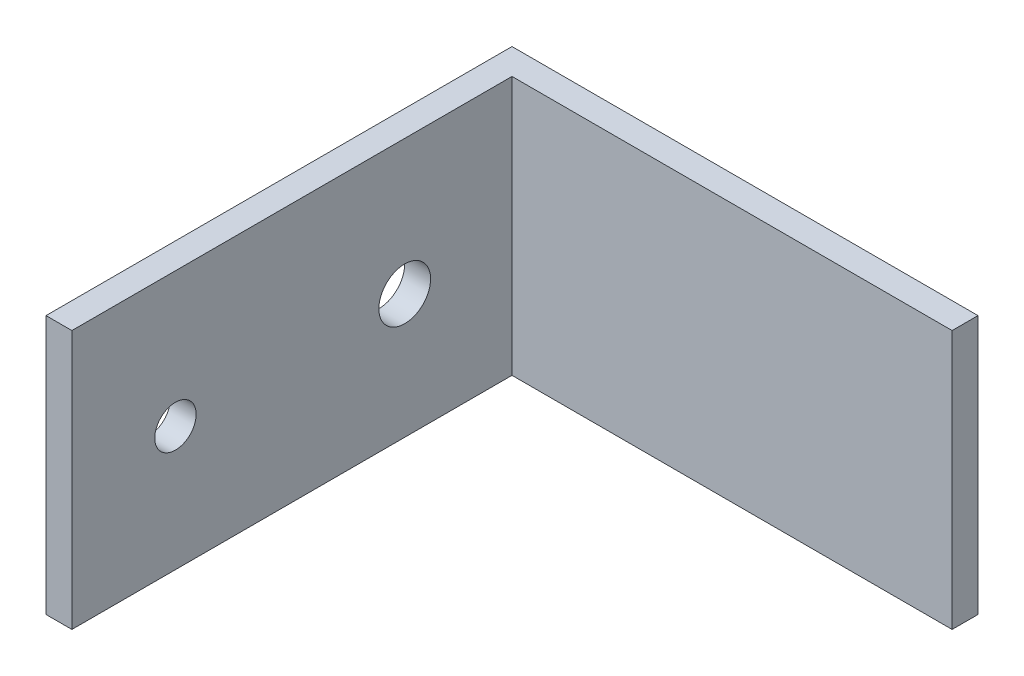
ISO-10303-21;
HEADER;
FILE_DESCRIPTION(('STEP AP214'),'2;1');
FILE_NAME('part.step','',(''),(''),'','','');
FILE_SCHEMA(('AUTOMOTIVE_DESIGN { 1 0 10303 214 1 1 1 1 }'));
ENDSEC;
DATA;
#1=APPLICATION_CONTEXT('core data for automotive mechanical design processes');
#2=APPLICATION_PROTOCOL_DEFINITION('international standard','automotive_design',2000,#1);
#3=PRODUCT_CONTEXT('',#1,'mechanical');
#4=PRODUCT('Part','Part','',(#3));
#5=PRODUCT_RELATED_PRODUCT_CATEGORY('part','',(#4));
#6=PRODUCT_DEFINITION_FORMATION('','',#4);
#7=PRODUCT_DEFINITION_CONTEXT('part definition',#1,'design');
#8=PRODUCT_DEFINITION('design','',#6,#7);
#9=PRODUCT_DEFINITION_SHAPE('','',#8);
#10=(LENGTH_UNIT() NAMED_UNIT(*) SI_UNIT(.MILLI.,.METRE.));
#11=(NAMED_UNIT(*) PLANE_ANGLE_UNIT() SI_UNIT($,.RADIAN.));
#12=(NAMED_UNIT(*) SI_UNIT($,.STERADIAN.) SOLID_ANGLE_UNIT());
#13=UNCERTAINTY_MEASURE_WITH_UNIT(LENGTH_MEASURE(1.E-05),#10,'distance_accuracy_value','');
#14=(GEOMETRIC_REPRESENTATION_CONTEXT(3) GLOBAL_UNCERTAINTY_ASSIGNED_CONTEXT((#13)) GLOBAL_UNIT_ASSIGNED_CONTEXT((#10,
#11,#12)) REPRESENTATION_CONTEXT('',''));
#15=CARTESIAN_POINT('',(0.,0.,0.));
#16=DIRECTION('',(0.,0.,1.));
#17=DIRECTION('',(1.,0.,0.));
#18=AXIS2_PLACEMENT_3D('',#15,#16,#17);
#19=CARTESIAN_POINT('',(0.,-50.,5.));
#20=DIRECTION('',(0.,1.,0.));
#21=DIRECTION('',(0.,0.,1.));
#22=AXIS2_PLACEMENT_3D('',#19,#20,#21);
#23=PLANE('',#22);
#24=DIRECTION('',(1.,0.,0.));
#25=VECTOR('',#24,1.);
#26=CARTESIAN_POINT('',(0.,-50.,0.));
#27=LINE('',#26,#25);
#28=CARTESIAN_POINT('',(-4.99999999999999,-50.,0.));
#29=VERTEX_POINT('',#28);
#30=CARTESIAN_POINT('',(85.,-50.,0.));
#31=VERTEX_POINT('',#30);
#32=EDGE_CURVE('E63',#29,#31,#27,.T.);
#33=ORIENTED_EDGE('',*,*,#32,.T.);
#34=DIRECTION('',(0.,0.,-1.));
#35=VECTOR('',#34,1.);
#36=CARTESIAN_POINT('',(85.,-50.,5.));
#37=LINE('',#36,#35);
#38=CARTESIAN_POINT('',(85.,-50.,5.));
#39=VERTEX_POINT('',#38);
#40=EDGE_CURVE('E11',#39,#31,#37,.T.);
#41=ORIENTED_EDGE('',*,*,#40,.F.);
#42=DIRECTION('',(1.,0.,0.));
#43=VECTOR('',#42,1.);
#44=CARTESIAN_POINT('',(0.,-50.,5.));
#45=LINE('',#44,#43);
#46=CARTESIAN_POINT('',(0.,-50.,5.));
#47=VERTEX_POINT('',#46);
#48=EDGE_CURVE('E92',#47,#39,#45,.T.);
#49=ORIENTED_EDGE('',*,*,#48,.F.);
#50=DIRECTION('',(0.,0.,1.));
#51=VECTOR('',#50,1.);
#52=CARTESIAN_POINT('',(0.,-50.,0.));
#53=LINE('',#52,#51);
#54=CARTESIAN_POINT('',(0.,-50.,90.));
#55=VERTEX_POINT('',#54);
#56=EDGE_CURVE('E82',#47,#55,#53,.T.);
#57=ORIENTED_EDGE('',*,*,#56,.T.);
#58=DIRECTION('',(1.,0.,0.));
#59=VECTOR('',#58,1.);
#60=CARTESIAN_POINT('',(-4.99999999999999,-50.,90.));
#61=LINE('',#60,#59);
#62=CARTESIAN_POINT('',(-4.99999999999999,-50.,90.));
#63=VERTEX_POINT('',#62);
#64=EDGE_CURVE('E102',#63,#55,#61,.T.);
#65=ORIENTED_EDGE('',*,*,#64,.F.);
#66=DIRECTION('',(0.,0.,1.));
#67=VECTOR('',#66,1.);
#68=CARTESIAN_POINT('',(-4.99999999999999,-50.,0.));
#69=LINE('',#68,#67);
#70=EDGE_CURVE('E124',#29,#63,#69,.T.);
#71=ORIENTED_EDGE('',*,*,#70,.F.);
#72=EDGE_LOOP('',(#33,#41,#49,#57,#65,#71));
#73=FACE_BOUND('',#72,.T.);
#74=ADVANCED_FACE('F35',(#73),#23,.F.);
#75=CARTESIAN_POINT('',(85.,0.,5.));
#76=DIRECTION('',(-1.,0.,0.));
#77=DIRECTION('',(0.,0.,1.));
#78=AXIS2_PLACEMENT_3D('',#75,#76,#77);
#79=PLANE('',#78);
#80=DIRECTION('',(0.,1.,0.));
#81=VECTOR('',#80,1.);
#82=CARTESIAN_POINT('',(85.,0.,0.));
#83=LINE('',#82,#81);
#84=CARTESIAN_POINT('',(85.,0.,0.));
#85=VERTEX_POINT('',#84);
#86=EDGE_CURVE('E99',#31,#85,#83,.T.);
#87=ORIENTED_EDGE('',*,*,#86,.T.);
#88=DIRECTION('',(0.,0.,-1.));
#89=VECTOR('',#88,1.);
#90=CARTESIAN_POINT('',(85.,0.,5.));
#91=LINE('',#90,#89);
#92=CARTESIAN_POINT('',(85.,0.,5.));
#93=VERTEX_POINT('',#92);
#94=EDGE_CURVE('E43',#93,#85,#91,.T.);
#95=ORIENTED_EDGE('',*,*,#94,.F.);
#96=DIRECTION('',(0.,1.,0.));
#97=VECTOR('',#96,1.);
#98=CARTESIAN_POINT('',(85.,0.,5.));
#99=LINE('',#98,#97);
#100=EDGE_CURVE('E51',#39,#93,#99,.T.);
#101=ORIENTED_EDGE('',*,*,#100,.F.);
#102=ORIENTED_EDGE('',*,*,#40,.T.);
#103=EDGE_LOOP('',(#87,#95,#101,#102));
#104=FACE_BOUND('',#103,.T.);
#105=ADVANCED_FACE('F164',(#104),#79,.F.);
#106=CARTESIAN_POINT('',(0.,0.,5.));
#107=DIRECTION('',(0.,-1.,0.));
#108=DIRECTION('',(0.,0.,-1.));
#109=AXIS2_PLACEMENT_3D('',#106,#107,#108);
#110=PLANE('',#109);
#111=DIRECTION('',(-1.,0.,0.));
#112=VECTOR('',#111,1.);
#113=CARTESIAN_POINT('',(0.,0.,0.));
#114=LINE('',#113,#112);
#115=CARTESIAN_POINT('',(-5.,0.,0.));
#116=VERTEX_POINT('',#115);
#117=EDGE_CURVE('E97',#85,#116,#114,.T.);
#118=ORIENTED_EDGE('',*,*,#117,.T.);
#119=DIRECTION('',(0.,0.,-1.));
#120=VECTOR('',#119,1.);
#121=CARTESIAN_POINT('',(-5.,0.,0.));
#122=LINE('',#121,#120);
#123=CARTESIAN_POINT('',(-5.,0.,90.));
#124=VERTEX_POINT('',#123);
#125=EDGE_CURVE('E136',#124,#116,#122,.T.);
#126=ORIENTED_EDGE('',*,*,#125,.F.);
#127=DIRECTION('',(1.,0.,0.));
#128=VECTOR('',#127,1.);
#129=CARTESIAN_POINT('',(-5.,0.,90.));
#130=LINE('',#129,#128);
#131=CARTESIAN_POINT('',(0.,0.,90.));
#132=VERTEX_POINT('',#131);
#133=EDGE_CURVE('E137',#124,#132,#130,.T.);
#134=ORIENTED_EDGE('',*,*,#133,.T.);
#135=DIRECTION('',(0.,0.,-1.));
#136=VECTOR('',#135,1.);
#137=CARTESIAN_POINT('',(0.,0.,0.));
#138=LINE('',#137,#136);
#139=CARTESIAN_POINT('',(0.,0.,5.));
#140=VERTEX_POINT('',#139);
#141=EDGE_CURVE('E125',#132,#140,#138,.T.);
#142=ORIENTED_EDGE('',*,*,#141,.T.);
#143=DIRECTION('',(-1.,0.,0.));
#144=VECTOR('',#143,1.);
#145=CARTESIAN_POINT('',(0.,0.,5.));
#146=LINE('',#145,#144);
#147=EDGE_CURVE('E96',#93,#140,#146,.T.);
#148=ORIENTED_EDGE('',*,*,#147,.F.);
#149=ORIENTED_EDGE('',*,*,#94,.T.);
#150=EDGE_LOOP('',(#118,#126,#134,#142,#148,#149));
#151=FACE_BOUND('',#150,.T.);
#152=ADVANCED_FACE('F111',(#151),#110,.F.);
#153=CARTESIAN_POINT('',(0.,0.,5.));
#154=DIRECTION('',(0.,0.,1.));
#155=DIRECTION('',(1.,0.,0.));
#156=AXIS2_PLACEMENT_3D('',#153,#154,#155);
#157=PLANE('',#156);
#158=DIRECTION('',(0.,-1.,0.));
#159=VECTOR('',#158,1.);
#160=CARTESIAN_POINT('',(0.,0.,5.));
#161=LINE('',#160,#159);
#162=EDGE_CURVE('E72',#140,#47,#161,.T.);
#163=ORIENTED_EDGE('',*,*,#162,.T.);
#164=ORIENTED_EDGE('',*,*,#48,.T.);
#165=ORIENTED_EDGE('',*,*,#100,.T.);
#166=ORIENTED_EDGE('',*,*,#147,.T.);
#167=EDGE_LOOP('',(#163,#164,#165,#166));
#168=FACE_BOUND('',#167,.T.);
#169=ADVANCED_FACE('F94',(#168),#157,.T.);
#170=CARTESIAN_POINT('',(0.,0.,0.));
#171=DIRECTION('',(0.,0.,1.));
#172=DIRECTION('',(1.,0.,0.));
#173=AXIS2_PLACEMENT_3D('',#170,#171,#172);
#174=PLANE('',#173);
#175=ORIENTED_EDGE('',*,*,#32,.F.);
#176=DIRECTION('',(0.,-1.,0.));
#177=VECTOR('',#176,1.);
#178=CARTESIAN_POINT('',(-5.,0.,0.));
#179=LINE('',#178,#177);
#180=EDGE_CURVE('E120',#116,#29,#179,.T.);
#181=ORIENTED_EDGE('',*,*,#180,.F.);
#182=ORIENTED_EDGE('',*,*,#117,.F.);
#183=ORIENTED_EDGE('',*,*,#86,.F.);
#184=EDGE_LOOP('',(#175,#181,#182,#183));
#185=FACE_BOUND('',#184,.T.);
#186=ADVANCED_FACE('F118',(#185),#174,.F.);
#187=CARTESIAN_POINT('',(-5.,0.,90.));
#188=DIRECTION('',(0.,0.,-1.));
#189=DIRECTION('',(-1.,0.,0.));
#190=AXIS2_PLACEMENT_3D('',#187,#188,#189);
#191=PLANE('',#190);
#192=DIRECTION('',(0.,1.,0.));
#193=VECTOR('',#192,1.);
#194=CARTESIAN_POINT('',(0.,0.,90.));
#195=LINE('',#194,#193);
#196=EDGE_CURVE('E87',#55,#132,#195,.T.);
#197=ORIENTED_EDGE('',*,*,#196,.T.);
#198=ORIENTED_EDGE('',*,*,#133,.F.);
#199=DIRECTION('',(0.,1.,0.));
#200=VECTOR('',#199,1.);
#201=CARTESIAN_POINT('',(-5.,0.,90.));
#202=LINE('',#201,#200);
#203=EDGE_CURVE('E127',#63,#124,#202,.T.);
#204=ORIENTED_EDGE('',*,*,#203,.F.);
#205=ORIENTED_EDGE('',*,*,#64,.T.);
#206=EDGE_LOOP('',(#197,#198,#204,#205));
#207=FACE_BOUND('',#206,.T.);
#208=ADVANCED_FACE('F143',(#207),#191,.F.);
#209=CARTESIAN_POINT('',(-5.,0.,0.));
#210=DIRECTION('',(-1.,0.,0.));
#211=DIRECTION('',(0.,-1.,0.));
#212=AXIS2_PLACEMENT_3D('',#209,#210,#211);
#213=PLANE('',#212);
#214=CARTESIAN_POINT('',(-5.,-26.,70.));
#215=DIRECTION('',(-1.,0.,0.));
#216=DIRECTION('',(0.,-1.,0.));
#217=AXIS2_PLACEMENT_3D('',#214,#215,#216);
#218=CIRCLE('',#217,4.00000000000001);
#219=CARTESIAN_POINT('',(-5.,-30.,70.));
#220=VERTEX_POINT('',#219);
#221=EDGE_CURVE('E224',#220,#220,#218,.T.);
#222=ORIENTED_EDGE('',*,*,#221,.F.);
#223=EDGE_LOOP('',(#222));
#224=FACE_BOUND('',#223,.T.);
#225=CARTESIAN_POINT('',(-5.,-26.,25.72));
#226=DIRECTION('',(-1.,0.,0.));
#227=DIRECTION('',(0.,-1.,0.));
#228=AXIS2_PLACEMENT_3D('',#225,#226,#227);
#229=CIRCLE('',#228,5.);
#230=CARTESIAN_POINT('',(-5.,-31.,25.72));
#231=VERTEX_POINT('',#230);
#232=EDGE_CURVE('E131',#231,#231,#229,.T.);
#233=ORIENTED_EDGE('',*,*,#232,.F.);
#234=EDGE_LOOP('',(#233));
#235=FACE_BOUND('',#234,.T.);
#236=ORIENTED_EDGE('',*,*,#180,.T.);
#237=ORIENTED_EDGE('',*,*,#70,.T.);
#238=ORIENTED_EDGE('',*,*,#203,.T.);
#239=ORIENTED_EDGE('',*,*,#125,.T.);
#240=EDGE_LOOP('',(#236,#237,#238,#239));
#241=FACE_BOUND('',#240,.T.);
#242=ADVANCED_FACE('F148',(#224,#235,#241),#213,.T.);
#243=CARTESIAN_POINT('',(0.,0.,0.));
#244=DIRECTION('',(-1.,0.,0.));
#245=DIRECTION('',(0.,-1.,0.));
#246=AXIS2_PLACEMENT_3D('',#243,#244,#245);
#247=PLANE('',#246);
#248=CARTESIAN_POINT('',(0.,-26.,70.));
#249=DIRECTION('',(-1.,0.,0.));
#250=DIRECTION('',(0.,-1.,0.));
#251=AXIS2_PLACEMENT_3D('',#248,#249,#250);
#252=CIRCLE('',#251,4.00000000000001);
#253=CARTESIAN_POINT('',(0.,-30.,70.));
#254=VERTEX_POINT('',#253);
#255=EDGE_CURVE('E90',#254,#254,#252,.T.);
#256=ORIENTED_EDGE('',*,*,#255,.T.);
#257=EDGE_LOOP('',(#256));
#258=FACE_BOUND('',#257,.T.);
#259=CARTESIAN_POINT('',(0.,-26.,25.72));
#260=DIRECTION('',(-1.,0.,0.));
#261=DIRECTION('',(0.,-1.,0.));
#262=AXIS2_PLACEMENT_3D('',#259,#260,#261);
#263=CIRCLE('',#262,5.);
#264=CARTESIAN_POINT('',(0.,-31.,25.72));
#265=VERTEX_POINT('',#264);
#266=EDGE_CURVE('E225',#265,#265,#263,.T.);
#267=ORIENTED_EDGE('',*,*,#266,.T.);
#268=EDGE_LOOP('',(#267));
#269=FACE_BOUND('',#268,.T.);
#270=ORIENTED_EDGE('',*,*,#162,.F.);
#271=ORIENTED_EDGE('',*,*,#141,.F.);
#272=ORIENTED_EDGE('',*,*,#196,.F.);
#273=ORIENTED_EDGE('',*,*,#56,.F.);
#274=EDGE_LOOP('',(#270,#271,#272,#273));
#275=FACE_BOUND('',#274,.T.);
#276=ADVANCED_FACE('F84',(#258,#269,#275),#247,.F.);
#277=CARTESIAN_POINT('',(0.,-26.,25.72));
#278=DIRECTION('',(-1.,0.,0.));
#279=DIRECTION('',(0.,-1.,0.));
#280=AXIS2_PLACEMENT_3D('',#277,#278,#279);
#281=CYLINDRICAL_SURFACE('',#280,5.);
#282=ORIENTED_EDGE('',*,*,#266,.F.);
#283=EDGE_LOOP('',(#282));
#284=FACE_BOUND('',#283,.T.);
#285=ORIENTED_EDGE('',*,*,#232,.T.);
#286=EDGE_LOOP('',(#285));
#287=FACE_BOUND('',#286,.T.);
#288=ADVANCED_FACE('F156',(#284,#287),#281,.F.);
#289=CARTESIAN_POINT('',(0.,-26.,70.));
#290=DIRECTION('',(-1.,0.,0.));
#291=DIRECTION('',(0.,-1.,0.));
#292=AXIS2_PLACEMENT_3D('',#289,#290,#291);
#293=CYLINDRICAL_SURFACE('',#292,4.00000000000001);
#294=ORIENTED_EDGE('',*,*,#255,.F.);
#295=EDGE_LOOP('',(#294));
#296=FACE_BOUND('',#295,.T.);
#297=ORIENTED_EDGE('',*,*,#221,.T.);
#298=EDGE_LOOP('',(#297));
#299=FACE_BOUND('',#298,.T.);
#300=ADVANCED_FACE('F207',(#296,#299),#293,.F.);
#301=CLOSED_SHELL('',(#74,#105,#152,#169,#186,#208,#242,#276,#288,#300));
#302=MANIFOLD_SOLID_BREP('B2',#301);
#303=ADVANCED_BREP_SHAPE_REPRESENTATION('',(#18,#302),#14);
#304=SHAPE_DEFINITION_REPRESENTATION(#9,#303);
ENDSEC;
END-ISO-10303-21;
